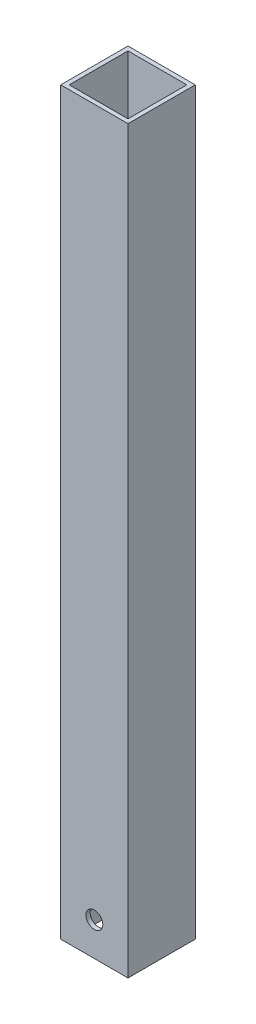
ISO-10303-21;
HEADER;
FILE_DESCRIPTION(('STEP AP214'),'2;1');
FILE_NAME('part.step','',(''),(''),'','','');
FILE_SCHEMA(('AUTOMOTIVE_DESIGN { 1 0 10303 214 1 1 1 1 }'));
ENDSEC;
DATA;
#1=APPLICATION_CONTEXT('core data for automotive mechanical design processes');
#2=APPLICATION_PROTOCOL_DEFINITION('international standard','automotive_design',2000,#1);
#3=PRODUCT_CONTEXT('',#1,'mechanical');
#4=PRODUCT('Part','Part','',(#3));
#5=PRODUCT_RELATED_PRODUCT_CATEGORY('part','',(#4));
#6=PRODUCT_DEFINITION_FORMATION('','',#4);
#7=PRODUCT_DEFINITION_CONTEXT('part definition',#1,'design');
#8=PRODUCT_DEFINITION('design','',#6,#7);
#9=PRODUCT_DEFINITION_SHAPE('','',#8);
#10=(LENGTH_UNIT() NAMED_UNIT(*) SI_UNIT(.MILLI.,.METRE.));
#11=(NAMED_UNIT(*) PLANE_ANGLE_UNIT() SI_UNIT($,.RADIAN.));
#12=(NAMED_UNIT(*) SI_UNIT($,.STERADIAN.) SOLID_ANGLE_UNIT());
#13=UNCERTAINTY_MEASURE_WITH_UNIT(LENGTH_MEASURE(1.E-05),#10,'distance_accuracy_value','');
#14=(GEOMETRIC_REPRESENTATION_CONTEXT(3) GLOBAL_UNCERTAINTY_ASSIGNED_CONTEXT((#13)) GLOBAL_UNIT_ASSIGNED_CONTEXT((#10,
#11,#12)) REPRESENTATION_CONTEXT('',''));
#15=CARTESIAN_POINT('',(0.,0.,0.));
#16=DIRECTION('',(0.,0.,1.));
#17=DIRECTION('',(1.,0.,0.));
#18=AXIS2_PLACEMENT_3D('',#15,#16,#17);
#19=CARTESIAN_POINT('',(0.,279.4,0.));
#20=DIRECTION('',(0.,-1.,0.));
#21=DIRECTION('',(0.,0.,-1.));
#22=AXIS2_PLACEMENT_3D('',#19,#20,#21);
#23=PLANE('',#22);
#24=DIRECTION('',(0.,0.,-1.));
#25=VECTOR('',#24,1.);
#26=CARTESIAN_POINT('',(12.7,279.4,12.7));
#27=LINE('',#26,#25);
#28=CARTESIAN_POINT('',(12.7,279.4,12.7));
#29=VERTEX_POINT('',#28);
#30=CARTESIAN_POINT('',(12.7,279.4,-12.7));
#31=VERTEX_POINT('',#30);
#32=EDGE_CURVE('E137',#29,#31,#27,.T.);
#33=ORIENTED_EDGE('',*,*,#32,.T.);
#34=DIRECTION('',(-1.,0.,0.));
#35=VECTOR('',#34,1.);
#36=CARTESIAN_POINT('',(-12.7,279.4,-12.7));
#37=LINE('',#36,#35);
#38=CARTESIAN_POINT('',(-12.7,279.4,-12.7));
#39=VERTEX_POINT('',#38);
#40=EDGE_CURVE('E140',#31,#39,#37,.T.);
#41=ORIENTED_EDGE('',*,*,#40,.T.);
#42=DIRECTION('',(0.,0.,1.));
#43=VECTOR('',#42,1.);
#44=CARTESIAN_POINT('',(-12.7,279.4,12.7));
#45=LINE('',#44,#43);
#46=CARTESIAN_POINT('',(-12.7,279.4,12.7));
#47=VERTEX_POINT('',#46);
#48=EDGE_CURVE('E143',#39,#47,#45,.T.);
#49=ORIENTED_EDGE('',*,*,#48,.T.);
#50=DIRECTION('',(1.,0.,0.));
#51=VECTOR('',#50,1.);
#52=CARTESIAN_POINT('',(-12.7,279.4,12.7));
#53=LINE('',#52,#51);
#54=EDGE_CURVE('E145',#47,#29,#53,.T.);
#55=ORIENTED_EDGE('',*,*,#54,.T.);
#56=EDGE_LOOP('',(#33,#41,#49,#55));
#57=FACE_BOUND('',#56,.T.);
#58=DIRECTION('',(0.,0.,-1.));
#59=VECTOR('',#58,1.);
#60=CARTESIAN_POINT('',(11.1125,279.4,11.1125));
#61=LINE('',#60,#59);
#62=CARTESIAN_POINT('',(11.1125,279.4,11.1125));
#63=VERTEX_POINT('',#62);
#64=CARTESIAN_POINT('',(11.1125,279.4,-11.1125));
#65=VERTEX_POINT('',#64);
#66=EDGE_CURVE('E99',#63,#65,#61,.T.);
#67=ORIENTED_EDGE('',*,*,#66,.F.);
#68=DIRECTION('',(1.,0.,0.));
#69=VECTOR('',#68,1.);
#70=CARTESIAN_POINT('',(-11.1125,279.4,11.1125));
#71=LINE('',#70,#69);
#72=CARTESIAN_POINT('',(-11.1125,279.4,11.1125));
#73=VERTEX_POINT('',#72);
#74=EDGE_CURVE('E121',#73,#63,#71,.T.);
#75=ORIENTED_EDGE('',*,*,#74,.F.);
#76=DIRECTION('',(0.,0.,1.));
#77=VECTOR('',#76,1.);
#78=CARTESIAN_POINT('',(-11.1125,279.4,11.1125));
#79=LINE('',#78,#77);
#80=CARTESIAN_POINT('',(-11.1125,279.4,-11.1125));
#81=VERTEX_POINT('',#80);
#82=EDGE_CURVE('E119',#81,#73,#79,.T.);
#83=ORIENTED_EDGE('',*,*,#82,.F.);
#84=DIRECTION('',(-1.,0.,0.));
#85=VECTOR('',#84,1.);
#86=CARTESIAN_POINT('',(-11.1125,279.4,-11.1125));
#87=LINE('',#86,#85);
#88=EDGE_CURVE('E107',#65,#81,#87,.T.);
#89=ORIENTED_EDGE('',*,*,#88,.F.);
#90=EDGE_LOOP('',(#67,#75,#83,#89));
#91=FACE_BOUND('',#90,.T.);
#92=ADVANCED_FACE('F33',(#57,#91),#23,.F.);
#93=CARTESIAN_POINT('',(0.,0.,0.));
#94=DIRECTION('',(0.,-1.,0.));
#95=DIRECTION('',(0.,0.,-1.));
#96=AXIS2_PLACEMENT_3D('',#93,#94,#95);
#97=PLANE('',#96);
#98=DIRECTION('',(0.,0.,-1.));
#99=VECTOR('',#98,1.);
#100=CARTESIAN_POINT('',(12.7,0.,12.7));
#101=LINE('',#100,#99);
#102=CARTESIAN_POINT('',(12.7,0.,12.7));
#103=VERTEX_POINT('',#102);
#104=CARTESIAN_POINT('',(12.7,0.,-12.7));
#105=VERTEX_POINT('',#104);
#106=EDGE_CURVE('E115',#103,#105,#101,.T.);
#107=ORIENTED_EDGE('',*,*,#106,.F.);
#108=DIRECTION('',(1.,0.,0.));
#109=VECTOR('',#108,1.);
#110=CARTESIAN_POINT('',(-12.7,0.,12.7));
#111=LINE('',#110,#109);
#112=CARTESIAN_POINT('',(-12.7,0.,12.7));
#113=VERTEX_POINT('',#112);
#114=EDGE_CURVE('E141',#113,#103,#111,.T.);
#115=ORIENTED_EDGE('',*,*,#114,.F.);
#116=DIRECTION('',(0.,0.,1.));
#117=VECTOR('',#116,1.);
#118=CARTESIAN_POINT('',(-12.7,0.,12.7));
#119=LINE('',#118,#117);
#120=CARTESIAN_POINT('',(-12.7,0.,-12.7));
#121=VERTEX_POINT('',#120);
#122=EDGE_CURVE('E152',#121,#113,#119,.T.);
#123=ORIENTED_EDGE('',*,*,#122,.F.);
#124=DIRECTION('',(-1.,0.,0.));
#125=VECTOR('',#124,1.);
#126=CARTESIAN_POINT('',(-12.7,0.,-12.7));
#127=LINE('',#126,#125);
#128=EDGE_CURVE('E150',#105,#121,#127,.T.);
#129=ORIENTED_EDGE('',*,*,#128,.F.);
#130=EDGE_LOOP('',(#107,#115,#123,#129));
#131=FACE_BOUND('',#130,.T.);
#132=DIRECTION('',(1.,0.,0.));
#133=VECTOR('',#132,1.);
#134=CARTESIAN_POINT('',(-11.1125,0.,11.1125));
#135=LINE('',#134,#133);
#136=CARTESIAN_POINT('',(-11.1125,0.,11.1125));
#137=VERTEX_POINT('',#136);
#138=CARTESIAN_POINT('',(11.1125,0.,11.1125));
#139=VERTEX_POINT('',#138);
#140=EDGE_CURVE('E108',#137,#139,#135,.T.);
#141=ORIENTED_EDGE('',*,*,#140,.T.);
#142=DIRECTION('',(0.,0.,-1.));
#143=VECTOR('',#142,1.);
#144=CARTESIAN_POINT('',(11.1125,0.,11.1125));
#145=LINE('',#144,#143);
#146=CARTESIAN_POINT('',(11.1125,0.,-11.1125));
#147=VERTEX_POINT('',#146);
#148=EDGE_CURVE('E57',#139,#147,#145,.T.);
#149=ORIENTED_EDGE('',*,*,#148,.T.);
#150=DIRECTION('',(-1.,0.,0.));
#151=VECTOR('',#150,1.);
#152=CARTESIAN_POINT('',(-11.1125,0.,-11.1125));
#153=LINE('',#152,#151);
#154=CARTESIAN_POINT('',(-11.1125,0.,-11.1125));
#155=VERTEX_POINT('',#154);
#156=EDGE_CURVE('E114',#147,#155,#153,.T.);
#157=ORIENTED_EDGE('',*,*,#156,.T.);
#158=DIRECTION('',(0.,0.,1.));
#159=VECTOR('',#158,1.);
#160=CARTESIAN_POINT('',(-11.1125,0.,11.1125));
#161=LINE('',#160,#159);
#162=EDGE_CURVE('E129',#155,#137,#161,.T.);
#163=ORIENTED_EDGE('',*,*,#162,.T.);
#164=EDGE_LOOP('',(#141,#149,#157,#163));
#165=FACE_BOUND('',#164,.T.);
#166=ADVANCED_FACE('F171',(#131,#165),#97,.T.);
#167=CARTESIAN_POINT('',(12.7,279.4,12.7));
#168=DIRECTION('',(-1.,0.,0.));
#169=DIRECTION('',(0.,0.,1.));
#170=AXIS2_PLACEMENT_3D('',#167,#168,#169);
#171=PLANE('',#170);
#172=ORIENTED_EDGE('',*,*,#106,.T.);
#173=DIRECTION('',(0.,-1.,0.));
#174=VECTOR('',#173,1.);
#175=CARTESIAN_POINT('',(12.7,279.4,-12.7));
#176=LINE('',#175,#174);
#177=EDGE_CURVE('E11',#31,#105,#176,.T.);
#178=ORIENTED_EDGE('',*,*,#177,.F.);
#179=ORIENTED_EDGE('',*,*,#32,.F.);
#180=DIRECTION('',(0.,-1.,0.));
#181=VECTOR('',#180,1.);
#182=CARTESIAN_POINT('',(12.7,279.4,12.7));
#183=LINE('',#182,#181);
#184=EDGE_CURVE('E147',#29,#103,#183,.T.);
#185=ORIENTED_EDGE('',*,*,#184,.T.);
#186=EDGE_LOOP('',(#172,#178,#179,#185));
#187=FACE_BOUND('',#186,.T.);
#188=ADVANCED_FACE('F35',(#187),#171,.F.);
#189=CARTESIAN_POINT('',(-12.7,279.4,-12.7));
#190=DIRECTION('',(0.,0.,1.));
#191=DIRECTION('',(1.,0.,0.));
#192=AXIS2_PLACEMENT_3D('',#189,#190,#191);
#193=PLANE('',#192);
#194=CARTESIAN_POINT('',(0.,12.7,-12.7));
#195=DIRECTION('',(0.,0.,1.));
#196=DIRECTION('',(1.,0.,0.));
#197=AXIS2_PLACEMENT_3D('',#194,#195,#196);
#198=CIRCLE('',#197,3.175);
#199=CARTESIAN_POINT('',(3.175,12.7,-12.7));
#200=VERTEX_POINT('',#199);
#201=EDGE_CURVE('E210',#200,#200,#198,.T.);
#202=ORIENTED_EDGE('',*,*,#201,.T.);
#203=EDGE_LOOP('',(#202));
#204=FACE_BOUND('',#203,.T.);
#205=ORIENTED_EDGE('',*,*,#128,.T.);
#206=DIRECTION('',(0.,-1.,0.));
#207=VECTOR('',#206,1.);
#208=CARTESIAN_POINT('',(-12.7,279.4,-12.7));
#209=LINE('',#208,#207);
#210=EDGE_CURVE('E42',#39,#121,#209,.T.);
#211=ORIENTED_EDGE('',*,*,#210,.F.);
#212=ORIENTED_EDGE('',*,*,#40,.F.);
#213=ORIENTED_EDGE('',*,*,#177,.T.);
#214=EDGE_LOOP('',(#205,#211,#212,#213));
#215=FACE_BOUND('',#214,.T.);
#216=ADVANCED_FACE('F181',(#204,#215),#193,.F.);
#217=CARTESIAN_POINT('',(-12.7,279.4,12.7));
#218=DIRECTION('',(1.,0.,0.));
#219=DIRECTION('',(0.,0.,-1.));
#220=AXIS2_PLACEMENT_3D('',#217,#218,#219);
#221=PLANE('',#220);
#222=ORIENTED_EDGE('',*,*,#122,.T.);
#223=DIRECTION('',(0.,-1.,0.));
#224=VECTOR('',#223,1.);
#225=CARTESIAN_POINT('',(-12.7,279.4,12.7));
#226=LINE('',#225,#224);
#227=EDGE_CURVE('E157',#47,#113,#226,.T.);
#228=ORIENTED_EDGE('',*,*,#227,.F.);
#229=ORIENTED_EDGE('',*,*,#48,.F.);
#230=ORIENTED_EDGE('',*,*,#210,.T.);
#231=EDGE_LOOP('',(#222,#228,#229,#230));
#232=FACE_BOUND('',#231,.T.);
#233=ADVANCED_FACE('F165',(#232),#221,.F.);
#234=CARTESIAN_POINT('',(-12.7,279.4,12.7));
#235=DIRECTION('',(0.,0.,-1.));
#236=DIRECTION('',(-1.,0.,0.));
#237=AXIS2_PLACEMENT_3D('',#234,#235,#236);
#238=PLANE('',#237);
#239=CARTESIAN_POINT('',(0.,12.7,12.7));
#240=DIRECTION('',(0.,0.,1.));
#241=DIRECTION('',(1.,0.,0.));
#242=AXIS2_PLACEMENT_3D('',#239,#240,#241);
#243=CIRCLE('',#242,3.175);
#244=CARTESIAN_POINT('',(3.175,12.7,12.7));
#245=VERTEX_POINT('',#244);
#246=EDGE_CURVE('E208',#245,#245,#243,.T.);
#247=ORIENTED_EDGE('',*,*,#246,.F.);
#248=EDGE_LOOP('',(#247));
#249=FACE_BOUND('',#248,.T.);
#250=ORIENTED_EDGE('',*,*,#114,.T.);
#251=ORIENTED_EDGE('',*,*,#184,.F.);
#252=ORIENTED_EDGE('',*,*,#54,.F.);
#253=ORIENTED_EDGE('',*,*,#227,.T.);
#254=EDGE_LOOP('',(#250,#251,#252,#253));
#255=FACE_BOUND('',#254,.T.);
#256=ADVANCED_FACE('F175',(#249,#255),#238,.F.);
#257=CARTESIAN_POINT('',(11.1125,279.4,11.1125));
#258=DIRECTION('',(-1.,0.,0.));
#259=DIRECTION('',(0.,0.,1.));
#260=AXIS2_PLACEMENT_3D('',#257,#258,#259);
#261=PLANE('',#260);
#262=ORIENTED_EDGE('',*,*,#148,.F.);
#263=DIRECTION('',(0.,-1.,0.));
#264=VECTOR('',#263,1.);
#265=CARTESIAN_POINT('',(11.1125,279.4,11.1125));
#266=LINE('',#265,#264);
#267=EDGE_CURVE('E103',#63,#139,#266,.T.);
#268=ORIENTED_EDGE('',*,*,#267,.F.);
#269=ORIENTED_EDGE('',*,*,#66,.T.);
#270=DIRECTION('',(0.,-1.,0.));
#271=VECTOR('',#270,1.);
#272=CARTESIAN_POINT('',(11.1125,279.4,-11.1125));
#273=LINE('',#272,#271);
#274=EDGE_CURVE('E102',#65,#147,#273,.T.);
#275=ORIENTED_EDGE('',*,*,#274,.T.);
#276=EDGE_LOOP('',(#262,#268,#269,#275));
#277=FACE_BOUND('',#276,.T.);
#278=ADVANCED_FACE('F101',(#277),#261,.T.);
#279=CARTESIAN_POINT('',(-11.1125,279.4,-11.1125));
#280=DIRECTION('',(0.,0.,1.));
#281=DIRECTION('',(1.,0.,0.));
#282=AXIS2_PLACEMENT_3D('',#279,#280,#281);
#283=PLANE('',#282);
#284=CARTESIAN_POINT('',(0.,12.7,-11.1125));
#285=DIRECTION('',(0.,0.,1.));
#286=DIRECTION('',(1.,0.,0.));
#287=AXIS2_PLACEMENT_3D('',#284,#285,#286);
#288=CIRCLE('',#287,3.175);
#289=CARTESIAN_POINT('',(3.175,12.7,-11.1125));
#290=VERTEX_POINT('',#289);
#291=EDGE_CURVE('E127',#290,#290,#288,.T.);
#292=ORIENTED_EDGE('',*,*,#291,.F.);
#293=EDGE_LOOP('',(#292));
#294=FACE_BOUND('',#293,.T.);
#295=ORIENTED_EDGE('',*,*,#156,.F.);
#296=ORIENTED_EDGE('',*,*,#274,.F.);
#297=ORIENTED_EDGE('',*,*,#88,.T.);
#298=DIRECTION('',(0.,-1.,0.));
#299=VECTOR('',#298,1.);
#300=CARTESIAN_POINT('',(-11.1125,279.4,-11.1125));
#301=LINE('',#300,#299);
#302=EDGE_CURVE('E116',#81,#155,#301,.T.);
#303=ORIENTED_EDGE('',*,*,#302,.T.);
#304=EDGE_LOOP('',(#295,#296,#297,#303));
#305=FACE_BOUND('',#304,.T.);
#306=ADVANCED_FACE('F111',(#294,#305),#283,.T.);
#307=CARTESIAN_POINT('',(-11.1125,279.4,11.1125));
#308=DIRECTION('',(1.,0.,0.));
#309=DIRECTION('',(0.,0.,-1.));
#310=AXIS2_PLACEMENT_3D('',#307,#308,#309);
#311=PLANE('',#310);
#312=ORIENTED_EDGE('',*,*,#162,.F.);
#313=ORIENTED_EDGE('',*,*,#302,.F.);
#314=ORIENTED_EDGE('',*,*,#82,.T.);
#315=DIRECTION('',(0.,-1.,0.));
#316=VECTOR('',#315,1.);
#317=CARTESIAN_POINT('',(-11.1125,279.4,11.1125));
#318=LINE('',#317,#316);
#319=EDGE_CURVE('E49',#73,#137,#318,.T.);
#320=ORIENTED_EDGE('',*,*,#319,.T.);
#321=EDGE_LOOP('',(#312,#313,#314,#320));
#322=FACE_BOUND('',#321,.T.);
#323=ADVANCED_FACE('F223',(#322),#311,.T.);
#324=CARTESIAN_POINT('',(-11.1125,279.4,11.1125));
#325=DIRECTION('',(0.,0.,-1.));
#326=DIRECTION('',(-1.,0.,0.));
#327=AXIS2_PLACEMENT_3D('',#324,#325,#326);
#328=PLANE('',#327);
#329=CARTESIAN_POINT('',(0.,12.7,11.1125));
#330=DIRECTION('',(0.,0.,-1.));
#331=DIRECTION('',(-1.,0.,0.));
#332=AXIS2_PLACEMENT_3D('',#329,#330,#331);
#333=CIRCLE('',#332,3.175);
#334=CARTESIAN_POINT('',(-3.175,12.7,11.1125));
#335=VERTEX_POINT('',#334);
#336=EDGE_CURVE('E37',#335,#335,#333,.T.);
#337=ORIENTED_EDGE('',*,*,#336,.F.);
#338=EDGE_LOOP('',(#337));
#339=FACE_BOUND('',#338,.T.);
#340=ORIENTED_EDGE('',*,*,#140,.F.);
#341=ORIENTED_EDGE('',*,*,#319,.F.);
#342=ORIENTED_EDGE('',*,*,#74,.T.);
#343=ORIENTED_EDGE('',*,*,#267,.T.);
#344=EDGE_LOOP('',(#340,#341,#342,#343));
#345=FACE_BOUND('',#344,.T.);
#346=ADVANCED_FACE('F221',(#339,#345),#328,.T.);
#347=CARTESIAN_POINT('',(0.,12.7,-12.7));
#348=DIRECTION('',(0.,0.,1.));
#349=DIRECTION('',(1.,0.,0.));
#350=AXIS2_PLACEMENT_3D('',#347,#348,#349);
#351=CYLINDRICAL_SURFACE('',#350,3.175);
#352=ORIENTED_EDGE('',*,*,#336,.T.);
#353=EDGE_LOOP('',(#352));
#354=FACE_BOUND('',#353,.T.);
#355=ORIENTED_EDGE('',*,*,#246,.T.);
#356=EDGE_LOOP('',(#355));
#357=FACE_BOUND('',#356,.T.);
#358=ADVANCED_FACE('F219',(#354,#357),#351,.F.);
#359=ORIENTED_EDGE('',*,*,#291,.T.);
#360=EDGE_LOOP('',(#359));
#361=FACE_BOUND('',#360,.T.);
#362=ORIENTED_EDGE('',*,*,#201,.F.);
#363=EDGE_LOOP('',(#362));
#364=FACE_BOUND('',#363,.T.);
#365=ADVANCED_FACE('F235',(#361,#364),#351,.F.);
#366=CLOSED_SHELL('',(#92,#166,#188,#216,#233,#256,#278,#306,#323,#346,#358,#365));
#367=MANIFOLD_SOLID_BREP('B2',#366);
#368=ADVANCED_BREP_SHAPE_REPRESENTATION('',(#18,#367),#14);
#369=SHAPE_DEFINITION_REPRESENTATION(#9,#368);
ENDSEC;
END-ISO-10303-21;
